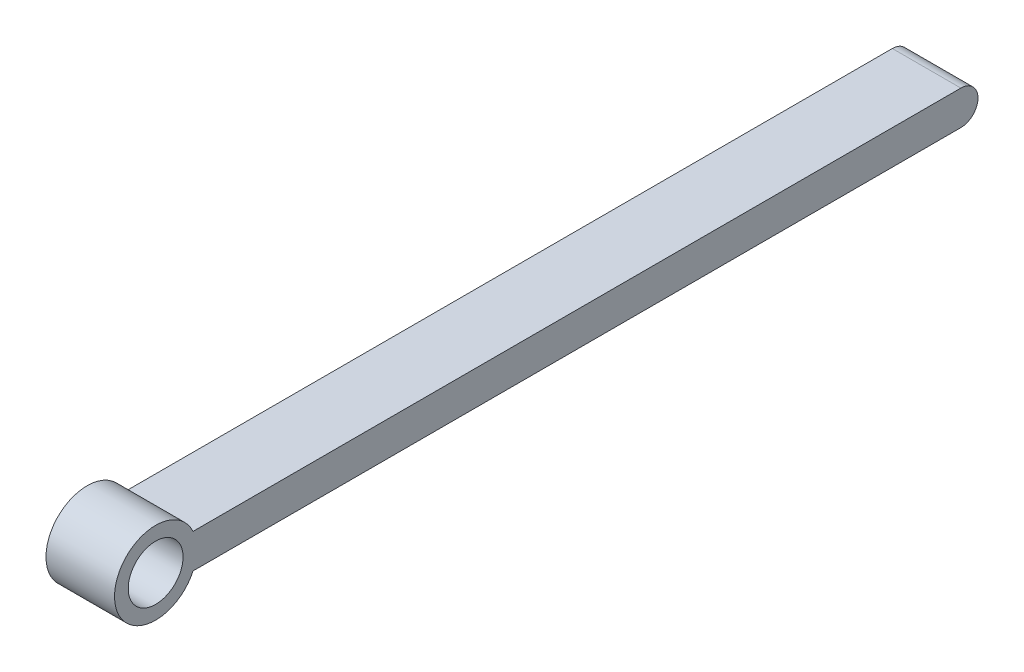
ISO-10303-21;
HEADER;
FILE_DESCRIPTION(('STEP AP214'),'2;1');
FILE_NAME('part.step','',(''),(''),'','','');
FILE_SCHEMA(('AUTOMOTIVE_DESIGN { 1 0 10303 214 1 1 1 1 }'));
ENDSEC;
DATA;
#1=APPLICATION_CONTEXT('core data for automotive mechanical design processes');
#2=APPLICATION_PROTOCOL_DEFINITION('international standard','automotive_design',2000,#1);
#3=PRODUCT_CONTEXT('',#1,'mechanical');
#4=PRODUCT('Part','Part','',(#3));
#5=PRODUCT_RELATED_PRODUCT_CATEGORY('part','',(#4));
#6=PRODUCT_DEFINITION_FORMATION('','',#4);
#7=PRODUCT_DEFINITION_CONTEXT('part definition',#1,'design');
#8=PRODUCT_DEFINITION('design','',#6,#7);
#9=PRODUCT_DEFINITION_SHAPE('','',#8);
#10=(LENGTH_UNIT() NAMED_UNIT(*) SI_UNIT(.MILLI.,.METRE.));
#11=(NAMED_UNIT(*) PLANE_ANGLE_UNIT() SI_UNIT($,.RADIAN.));
#12=(NAMED_UNIT(*) SI_UNIT($,.STERADIAN.) SOLID_ANGLE_UNIT());
#13=UNCERTAINTY_MEASURE_WITH_UNIT(LENGTH_MEASURE(1.E-05),#10,'distance_accuracy_value','');
#14=(GEOMETRIC_REPRESENTATION_CONTEXT(3) GLOBAL_UNCERTAINTY_ASSIGNED_CONTEXT((#13)) GLOBAL_UNIT_ASSIGNED_CONTEXT((#10,
#11,#12)) REPRESENTATION_CONTEXT('',''));
#15=CARTESIAN_POINT('',(0.,0.,0.));
#16=DIRECTION('',(0.,0.,1.));
#17=DIRECTION('',(1.,0.,0.));
#18=AXIS2_PLACEMENT_3D('',#15,#16,#17);
#19=CARTESIAN_POINT('',(10.,18.1245417068373,-19.5728478067927));
#20=DIRECTION('',(-1.,0.,0.));
#21=DIRECTION('',(0.,0.,1.));
#22=AXIS2_PLACEMENT_3D('',#19,#20,#21);
#23=CYLINDRICAL_SURFACE('',#22,6.);
#24=CARTESIAN_POINT('',(0.,18.1245417068373,-19.5728478067927));
#25=DIRECTION('',(1.,0.,0.));
#26=DIRECTION('',(0.,0.,-1.));
#27=AXIS2_PLACEMENT_3D('',#24,#25,#26);
#28=CIRCLE('',#27,6.);
#29=CARTESIAN_POINT('',(0.,20.6245417068374,-25.0272038641105));
#30=VERTEX_POINT('',#29);
#31=CARTESIAN_POINT('',(0.,15.6245417068374,-25.0272038641106));
#32=VERTEX_POINT('',#31);
#33=EDGE_CURVE('E102',#30,#32,#28,.T.);
#34=ORIENTED_EDGE('',*,*,#33,.T.);
#35=DIRECTION('',(-1.,0.,0.));
#36=VECTOR('',#35,1.);
#37=CARTESIAN_POINT('',(10.,15.6245417068374,-25.0272038641106));
#38=LINE('',#37,#36);
#39=CARTESIAN_POINT('',(10.,15.6245417068374,-25.0272038641106));
#40=VERTEX_POINT('',#39);
#41=EDGE_CURVE('E11',#40,#32,#38,.T.);
#42=ORIENTED_EDGE('',*,*,#41,.F.);
#43=CARTESIAN_POINT('',(10.,18.1245417068373,-19.5728478067927));
#44=DIRECTION('',(1.,0.,0.));
#45=DIRECTION('',(0.,0.,-1.));
#46=AXIS2_PLACEMENT_3D('',#43,#44,#45);
#47=CIRCLE('',#46,6.);
#48=CARTESIAN_POINT('',(10.,20.6245417068374,-25.0272038641105));
#49=VERTEX_POINT('',#48);
#50=EDGE_CURVE('E85',#49,#40,#47,.T.);
#51=ORIENTED_EDGE('',*,*,#50,.F.);
#52=DIRECTION('',(-1.,0.,0.));
#53=VECTOR('',#52,1.);
#54=CARTESIAN_POINT('',(10.,20.6245417068374,-25.0272038641105));
#55=LINE('',#54,#53);
#56=EDGE_CURVE('E51',#49,#30,#55,.T.);
#57=ORIENTED_EDGE('',*,*,#56,.T.);
#58=EDGE_LOOP('',(#34,#42,#51,#57));
#59=FACE_BOUND('',#58,.T.);
#60=ADVANCED_FACE('F35',(#59),#23,.T.);
#61=CARTESIAN_POINT('',(10.,15.6245417068374,0.));
#62=DIRECTION('',(0.,1.,0.));
#63=DIRECTION('',(0.,0.,1.));
#64=AXIS2_PLACEMENT_3D('',#61,#62,#63);
#65=PLANE('',#64);
#66=DIRECTION('',(0.,0.,-1.));
#67=VECTOR('',#66,1.);
#68=CARTESIAN_POINT('',(0.,15.6245417068374,0.));
#69=LINE('',#68,#67);
#70=CARTESIAN_POINT('',(0.,15.6245417068374,-137.072847806793));
#71=VERTEX_POINT('',#70);
#72=EDGE_CURVE('E90',#32,#71,#69,.T.);
#73=ORIENTED_EDGE('',*,*,#72,.T.);
#74=DIRECTION('',(-1.,0.,0.));
#75=VECTOR('',#74,1.);
#76=CARTESIAN_POINT('',(10.,15.6245417068374,-137.072847806793));
#77=LINE('',#76,#75);
#78=CARTESIAN_POINT('',(10.,15.6245417068374,-137.072847806793));
#79=VERTEX_POINT('',#78);
#80=EDGE_CURVE('E43',#79,#71,#77,.T.);
#81=ORIENTED_EDGE('',*,*,#80,.F.);
#82=DIRECTION('',(0.,0.,-1.));
#83=VECTOR('',#82,1.);
#84=CARTESIAN_POINT('',(10.,15.6245417068374,0.));
#85=LINE('',#84,#83);
#86=EDGE_CURVE('E76',#40,#79,#85,.T.);
#87=ORIENTED_EDGE('',*,*,#86,.F.);
#88=ORIENTED_EDGE('',*,*,#41,.T.);
#89=EDGE_LOOP('',(#73,#81,#87,#88));
#90=FACE_BOUND('',#89,.T.);
#91=ADVANCED_FACE('F89',(#90),#65,.F.);
#92=CARTESIAN_POINT('',(10.,18.1245417068374,-137.072847806793));
#93=DIRECTION('',(-1.,0.,0.));
#94=DIRECTION('',(0.,0.,1.));
#95=AXIS2_PLACEMENT_3D('',#92,#93,#94);
#96=CYLINDRICAL_SURFACE('',#95,2.50000000000002);
#97=CARTESIAN_POINT('',(0.,18.1245417068374,-137.072847806793));
#98=DIRECTION('',(1.,0.,0.));
#99=DIRECTION('',(0.,0.,-1.));
#100=AXIS2_PLACEMENT_3D('',#97,#98,#99);
#101=CIRCLE('',#100,2.50000000000002);
#102=CARTESIAN_POINT('',(0.,20.6245417068374,-137.072847806793));
#103=VERTEX_POINT('',#102);
#104=EDGE_CURVE('E105',#103,#71,#101,.F.);
#105=ORIENTED_EDGE('',*,*,#104,.F.);
#106=DIRECTION('',(-1.,0.,0.));
#107=VECTOR('',#106,1.);
#108=CARTESIAN_POINT('',(10.,20.6245417068374,-137.072847806793));
#109=LINE('',#108,#107);
#110=CARTESIAN_POINT('',(10.,20.6245417068374,-137.072847806793));
#111=VERTEX_POINT('',#110);
#112=EDGE_CURVE('E65',#111,#103,#109,.T.);
#113=ORIENTED_EDGE('',*,*,#112,.F.);
#114=CARTESIAN_POINT('',(10.,18.1245417068374,-137.072847806793));
#115=DIRECTION('',(1.,0.,0.));
#116=DIRECTION('',(0.,0.,-1.));
#117=AXIS2_PLACEMENT_3D('',#114,#115,#116);
#118=CIRCLE('',#117,2.50000000000002);
#119=EDGE_CURVE('E84',#111,#79,#118,.F.);
#120=ORIENTED_EDGE('',*,*,#119,.T.);
#121=ORIENTED_EDGE('',*,*,#80,.T.);
#122=EDGE_LOOP('',(#105,#113,#120,#121));
#123=FACE_BOUND('',#122,.T.);
#124=ADVANCED_FACE('F93',(#123),#96,.T.);
#125=CARTESIAN_POINT('',(10.,20.6245417068374,0.));
#126=DIRECTION('',(0.,1.,0.));
#127=DIRECTION('',(0.,0.,1.));
#128=AXIS2_PLACEMENT_3D('',#125,#126,#127);
#129=PLANE('',#128);
#130=DIRECTION('',(0.,0.,-1.));
#131=VECTOR('',#130,1.);
#132=CARTESIAN_POINT('',(0.,20.6245417068374,0.));
#133=LINE('',#132,#131);
#134=EDGE_CURVE('E107',#30,#103,#133,.T.);
#135=ORIENTED_EDGE('',*,*,#134,.F.);
#136=ORIENTED_EDGE('',*,*,#56,.F.);
#137=DIRECTION('',(0.,0.,-1.));
#138=VECTOR('',#137,1.);
#139=CARTESIAN_POINT('',(10.,20.6245417068374,0.));
#140=LINE('',#139,#138);
#141=EDGE_CURVE('E94',#49,#111,#140,.T.);
#142=ORIENTED_EDGE('',*,*,#141,.T.);
#143=ORIENTED_EDGE('',*,*,#112,.T.);
#144=EDGE_LOOP('',(#135,#136,#142,#143));
#145=FACE_BOUND('',#144,.T.);
#146=ADVANCED_FACE('F120',(#145),#129,.T.);
#147=CARTESIAN_POINT('',(10.,18.1245417068373,-19.5728478067927));
#148=DIRECTION('',(-1.,0.,0.));
#149=DIRECTION('',(0.,0.,1.));
#150=AXIS2_PLACEMENT_3D('',#147,#148,#149);
#151=CYLINDRICAL_SURFACE('',#150,4.);
#152=CARTESIAN_POINT('',(10.,18.1245417068373,-19.5728478067927));
#153=DIRECTION('',(1.,0.,0.));
#154=DIRECTION('',(0.,0.,-1.));
#155=AXIS2_PLACEMENT_3D('',#152,#153,#154);
#156=CIRCLE('',#155,4.);
#157=CARTESIAN_POINT('',(10.,18.1245417068373,-23.5728478067927));
#158=VERTEX_POINT('',#157);
#159=EDGE_CURVE('E96',#158,#158,#156,.T.);
#160=ORIENTED_EDGE('',*,*,#159,.T.);
#161=EDGE_LOOP('',(#160));
#162=FACE_BOUND('',#161,.T.);
#163=CARTESIAN_POINT('',(0.,18.1245417068373,-19.5728478067927));
#164=DIRECTION('',(1.,0.,0.));
#165=DIRECTION('',(0.,0.,-1.));
#166=AXIS2_PLACEMENT_3D('',#163,#164,#165);
#167=CIRCLE('',#166,4.);
#168=CARTESIAN_POINT('',(0.,18.1245417068373,-23.5728478067927));
#169=VERTEX_POINT('',#168);
#170=EDGE_CURVE('E110',#169,#169,#167,.T.);
#171=ORIENTED_EDGE('',*,*,#170,.F.);
#172=EDGE_LOOP('',(#171));
#173=FACE_BOUND('',#172,.T.);
#174=ADVANCED_FACE('F118',(#162,#173),#151,.F.);
#175=CARTESIAN_POINT('',(10.,0.,0.));
#176=DIRECTION('',(1.,0.,0.));
#177=DIRECTION('',(0.,0.,-1.));
#178=AXIS2_PLACEMENT_3D('',#175,#176,#177);
#179=PLANE('',#178);
#180=ORIENTED_EDGE('',*,*,#50,.T.);
#181=ORIENTED_EDGE('',*,*,#86,.T.);
#182=ORIENTED_EDGE('',*,*,#119,.F.);
#183=ORIENTED_EDGE('',*,*,#141,.F.);
#184=EDGE_LOOP('',(#180,#181,#182,#183));
#185=FACE_BOUND('',#184,.T.);
#186=ORIENTED_EDGE('',*,*,#159,.F.);
#187=EDGE_LOOP('',(#186));
#188=FACE_BOUND('',#187,.T.);
#189=ADVANCED_FACE('F80',(#185,#188),#179,.T.);
#190=CARTESIAN_POINT('',(0.,0.,0.));
#191=DIRECTION('',(1.,0.,0.));
#192=DIRECTION('',(0.,0.,-1.));
#193=AXIS2_PLACEMENT_3D('',#190,#191,#192);
#194=PLANE('',#193);
#195=ORIENTED_EDGE('',*,*,#33,.F.);
#196=ORIENTED_EDGE('',*,*,#134,.T.);
#197=ORIENTED_EDGE('',*,*,#104,.T.);
#198=ORIENTED_EDGE('',*,*,#72,.F.);
#199=EDGE_LOOP('',(#195,#196,#197,#198));
#200=FACE_BOUND('',#199,.T.);
#201=ORIENTED_EDGE('',*,*,#170,.T.);
#202=EDGE_LOOP('',(#201));
#203=FACE_BOUND('',#202,.T.);
#204=ADVANCED_FACE('F116',(#200,#203),#194,.F.);
#205=CLOSED_SHELL('',(#60,#91,#124,#146,#174,#189,#204));
#206=MANIFOLD_SOLID_BREP('B2',#205);
#207=ADVANCED_BREP_SHAPE_REPRESENTATION('',(#18,#206),#14);
#208=SHAPE_DEFINITION_REPRESENTATION(#9,#207);
ENDSEC;
END-ISO-10303-21;
